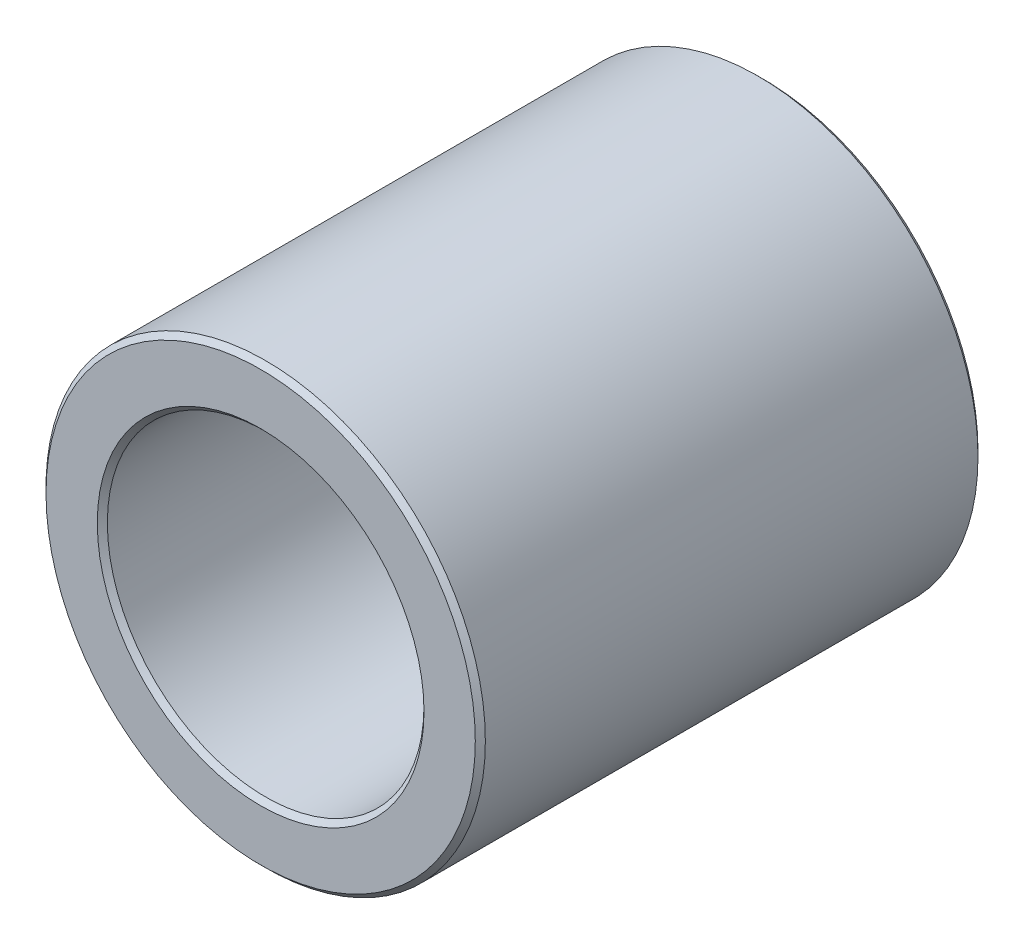
ISO-10303-21;
HEADER;
FILE_DESCRIPTION(('STEP AP214'),'2;1');
FILE_NAME('part.step','',(''),(''),'','','');
FILE_SCHEMA(('AUTOMOTIVE_DESIGN { 1 0 10303 214 1 1 1 1 }'));
ENDSEC;
DATA;
#1=APPLICATION_CONTEXT('core data for automotive mechanical design processes');
#2=APPLICATION_PROTOCOL_DEFINITION('international standard','automotive_design',2000,#1);
#3=PRODUCT_CONTEXT('',#1,'mechanical');
#4=PRODUCT('Part','Part','',(#3));
#5=PRODUCT_RELATED_PRODUCT_CATEGORY('part','',(#4));
#6=PRODUCT_DEFINITION_FORMATION('','',#4);
#7=PRODUCT_DEFINITION_CONTEXT('part definition',#1,'design');
#8=PRODUCT_DEFINITION('design','',#6,#7);
#9=PRODUCT_DEFINITION_SHAPE('','',#8);
#10=(LENGTH_UNIT() NAMED_UNIT(*) SI_UNIT(.MILLI.,.METRE.));
#11=(NAMED_UNIT(*) PLANE_ANGLE_UNIT() SI_UNIT($,.RADIAN.));
#12=(NAMED_UNIT(*) SI_UNIT($,.STERADIAN.) SOLID_ANGLE_UNIT());
#13=UNCERTAINTY_MEASURE_WITH_UNIT(LENGTH_MEASURE(1.E-05),#10,'distance_accuracy_value','');
#14=(GEOMETRIC_REPRESENTATION_CONTEXT(3) GLOBAL_UNCERTAINTY_ASSIGNED_CONTEXT((#13)) GLOBAL_UNIT_ASSIGNED_CONTEXT((#10,
#11,#12)) REPRESENTATION_CONTEXT('',''));
#15=CARTESIAN_POINT('',(0.,0.,0.));
#16=DIRECTION('',(0.,0.,1.));
#17=DIRECTION('',(1.,0.,0.));
#18=AXIS2_PLACEMENT_3D('',#15,#16,#17);
#19=CARTESIAN_POINT('',(0.,0.,12.7));
#20=DIRECTION('',(0.,0.,1.));
#21=DIRECTION('',(1.,0.,0.));
#22=AXIS2_PLACEMENT_3D('',#19,#20,#21);
#23=PLANE('',#22);
#24=CARTESIAN_POINT('',(0.,0.,12.7));
#25=DIRECTION('',(0.,0.,1.));
#26=DIRECTION('',(1.,0.,0.));
#27=AXIS2_PLACEMENT_3D('',#24,#25,#26);
#28=CIRCLE('',#27,4.12700000100001);
#29=CARTESIAN_POINT('',(4.12700000100001,0.,12.7));
#30=VERTEX_POINT('',#29);
#31=EDGE_CURVE('E59',#30,#30,#28,.F.);
#32=ORIENTED_EDGE('',*,*,#31,.T.);
#33=EDGE_LOOP('',(#32));
#34=FACE_BOUND('',#33,.T.);
#35=CARTESIAN_POINT('',(0.,0.,12.7));
#36=DIRECTION('',(0.,0.,1.));
#37=DIRECTION('',(1.,0.,0.));
#38=AXIS2_PLACEMENT_3D('',#35,#36,#37);
#39=CIRCLE('',#38,5.4229);
#40=CARTESIAN_POINT('',(5.4229,0.,12.7));
#41=VERTEX_POINT('',#40);
#42=EDGE_CURVE('E64',#41,#41,#39,.T.);
#43=ORIENTED_EDGE('',*,*,#42,.T.);
#44=EDGE_LOOP('',(#43));
#45=FACE_BOUND('',#44,.T.);
#46=ADVANCED_FACE('F45',(#34,#45),#23,.T.);
#47=CARTESIAN_POINT('',(0.,0.,0.));
#48=DIRECTION('',(0.,0.,1.));
#49=DIRECTION('',(1.,0.,0.));
#50=AXIS2_PLACEMENT_3D('',#47,#48,#49);
#51=PLANE('',#50);
#52=CARTESIAN_POINT('',(0.,0.,0.));
#53=DIRECTION('',(0.,0.,1.));
#54=DIRECTION('',(1.,0.,0.));
#55=AXIS2_PLACEMENT_3D('',#52,#53,#54);
#56=CIRCLE('',#55,4.127000001);
#57=CARTESIAN_POINT('',(4.127000001,0.,0.));
#58=VERTEX_POINT('',#57);
#59=EDGE_CURVE('E78',#58,#58,#56,.T.);
#60=ORIENTED_EDGE('',*,*,#59,.T.);
#61=EDGE_LOOP('',(#60));
#62=FACE_BOUND('',#61,.T.);
#63=CARTESIAN_POINT('',(0.,0.,0.));
#64=DIRECTION('',(0.,0.,1.));
#65=DIRECTION('',(1.,0.,0.));
#66=AXIS2_PLACEMENT_3D('',#63,#64,#65);
#67=CIRCLE('',#66,5.42289999999999);
#68=CARTESIAN_POINT('',(5.42289999999999,0.,0.));
#69=VERTEX_POINT('',#68);
#70=EDGE_CURVE('E82',#69,#69,#67,.F.);
#71=ORIENTED_EDGE('',*,*,#70,.T.);
#72=EDGE_LOOP('',(#71));
#73=FACE_BOUND('',#72,.T.);
#74=ADVANCED_FACE('F87',(#62,#73),#51,.F.);
#75=CARTESIAN_POINT('',(0.,0.,12.7));
#76=DIRECTION('',(0.,0.,-1.));
#77=DIRECTION('',(-1.,0.,0.));
#78=AXIS2_PLACEMENT_3D('',#75,#76,#77);
#79=CYLINDRICAL_SURFACE('',#78,5.5499);
#80=CARTESIAN_POINT('',(0.,0.,0.127000000000002));
#81=DIRECTION('',(0.,0.,1.));
#82=DIRECTION('',(1.,0.,0.));
#83=AXIS2_PLACEMENT_3D('',#80,#81,#82);
#84=CIRCLE('',#83,5.5499);
#85=CARTESIAN_POINT('',(5.5499,0.,0.127000000000002));
#86=VERTEX_POINT('',#85);
#87=EDGE_CURVE('E10',#86,#86,#84,.T.);
#88=ORIENTED_EDGE('',*,*,#87,.T.);
#89=EDGE_LOOP('',(#88));
#90=FACE_BOUND('',#89,.T.);
#91=CARTESIAN_POINT('',(0.,0.,12.573));
#92=DIRECTION('',(0.,0.,1.));
#93=DIRECTION('',(1.,0.,0.));
#94=AXIS2_PLACEMENT_3D('',#91,#92,#93);
#95=CIRCLE('',#94,5.5499);
#96=CARTESIAN_POINT('',(5.5499,0.,12.573));
#97=VERTEX_POINT('',#96);
#98=EDGE_CURVE('E54',#97,#97,#95,.F.);
#99=ORIENTED_EDGE('',*,*,#98,.T.);
#100=EDGE_LOOP('',(#99));
#101=FACE_BOUND('',#100,.T.);
#102=ADVANCED_FACE('F108',(#90,#101),#79,.T.);
#103=CARTESIAN_POINT('',(0.,0.,12.7));
#104=DIRECTION('',(0.,0.,-1.));
#105=DIRECTION('',(-1.,0.,0.));
#106=AXIS2_PLACEMENT_3D('',#103,#104,#105);
#107=CYLINDRICAL_SURFACE('',#106,4.000000001);
#108=CARTESIAN_POINT('',(0.,0.,0.127000000000002));
#109=DIRECTION('',(0.,0.,1.));
#110=DIRECTION('',(1.,0.,0.));
#111=AXIS2_PLACEMENT_3D('',#108,#109,#110);
#112=CIRCLE('',#111,4.000000001);
#113=CARTESIAN_POINT('',(4.000000001,0.,0.127000000000002));
#114=VERTEX_POINT('',#113);
#115=EDGE_CURVE('E70',#114,#114,#112,.F.);
#116=ORIENTED_EDGE('',*,*,#115,.T.);
#117=EDGE_LOOP('',(#116));
#118=FACE_BOUND('',#117,.T.);
#119=CARTESIAN_POINT('',(0.,0.,12.573));
#120=DIRECTION('',(0.,0.,1.));
#121=DIRECTION('',(1.,0.,0.));
#122=AXIS2_PLACEMENT_3D('',#119,#120,#121);
#123=CIRCLE('',#122,4.000000001);
#124=CARTESIAN_POINT('',(4.000000001,0.,12.573));
#125=VERTEX_POINT('',#124);
#126=EDGE_CURVE('E74',#125,#125,#123,.T.);
#127=ORIENTED_EDGE('',*,*,#126,.T.);
#128=EDGE_LOOP('',(#127));
#129=FACE_BOUND('',#128,.T.);
#130=ADVANCED_FACE('F113',(#118,#129),#107,.F.);
#131=CARTESIAN_POINT('',(0.,0.,0.));
#132=DIRECTION('',(0.,0.,-1.));
#133=DIRECTION('',(-1.,0.,0.));
#134=AXIS2_PLACEMENT_3D('',#131,#132,#133);
#135=CONICAL_SURFACE('',#134,4.127000001,0.785398163397442);
#136=ORIENTED_EDGE('',*,*,#115,.F.);
#137=EDGE_LOOP('',(#136));
#138=FACE_BOUND('',#137,.T.);
#139=ORIENTED_EDGE('',*,*,#59,.F.);
#140=EDGE_LOOP('',(#139));
#141=FACE_BOUND('',#140,.T.);
#142=ADVANCED_FACE('F98',(#138,#141),#135,.F.);
#143=CARTESIAN_POINT('',(0.,0.,12.573));
#144=DIRECTION('',(0.,0.,1.));
#145=DIRECTION('',(1.,0.,0.));
#146=AXIS2_PLACEMENT_3D('',#143,#144,#145);
#147=CONICAL_SURFACE('',#146,4.000000001,0.785398163397448);
#148=ORIENTED_EDGE('',*,*,#31,.F.);
#149=EDGE_LOOP('',(#148));
#150=FACE_BOUND('',#149,.T.);
#151=ORIENTED_EDGE('',*,*,#126,.F.);
#152=EDGE_LOOP('',(#151));
#153=FACE_BOUND('',#152,.T.);
#154=ADVANCED_FACE('F92',(#150,#153),#147,.F.);
#155=CARTESIAN_POINT('',(0.,0.,0.127000000000002));
#156=DIRECTION('',(0.,0.,1.));
#157=DIRECTION('',(1.,0.,0.));
#158=AXIS2_PLACEMENT_3D('',#155,#156,#157);
#159=CONICAL_SURFACE('',#158,5.5499,0.785398163397452);
#160=ORIENTED_EDGE('',*,*,#70,.F.);
#161=EDGE_LOOP('',(#160));
#162=FACE_BOUND('',#161,.T.);
#163=ORIENTED_EDGE('',*,*,#87,.F.);
#164=EDGE_LOOP('',(#163));
#165=FACE_BOUND('',#164,.T.);
#166=ADVANCED_FACE('F89',(#162,#165),#159,.T.);
#167=CARTESIAN_POINT('',(0.,0.,12.7));
#168=DIRECTION('',(0.,0.,-1.));
#169=DIRECTION('',(-1.,0.,0.));
#170=AXIS2_PLACEMENT_3D('',#167,#168,#169);
#171=CONICAL_SURFACE('',#170,5.4229,0.785398163397455);
#172=ORIENTED_EDGE('',*,*,#98,.F.);
#173=EDGE_LOOP('',(#172));
#174=FACE_BOUND('',#173,.T.);
#175=ORIENTED_EDGE('',*,*,#42,.F.);
#176=EDGE_LOOP('',(#175));
#177=FACE_BOUND('',#176,.T.);
#178=ADVANCED_FACE('F48',(#174,#177),#171,.T.);
#179=CLOSED_SHELL('',(#46,#74,#102,#130,#142,#154,#166,#178));
#180=MANIFOLD_SOLID_BREP('B2',#179);
#181=ADVANCED_BREP_SHAPE_REPRESENTATION('',(#18,#180),#14);
#182=SHAPE_DEFINITION_REPRESENTATION(#9,#181);
ENDSEC;
END-ISO-10303-21;
